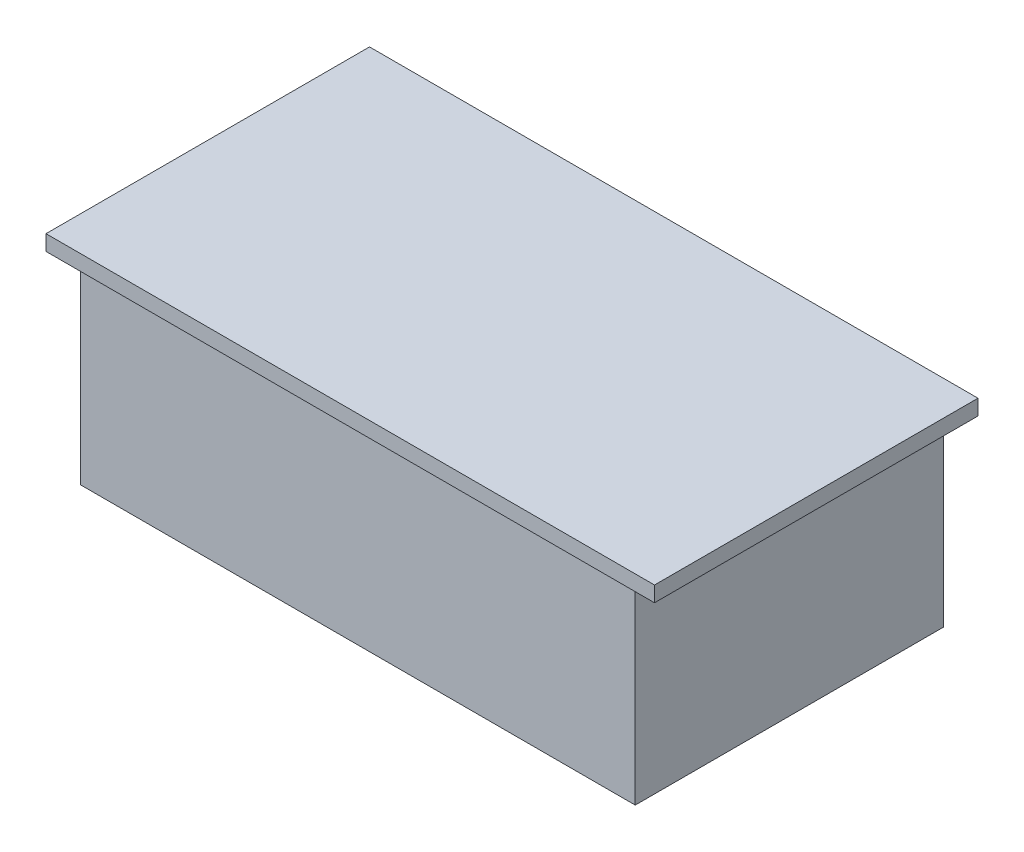
ISO-10303-21;
HEADER;
FILE_DESCRIPTION(('STEP AP214'),'2;1');
FILE_NAME('part.step','',(''),(''),'','','');
FILE_SCHEMA(('AUTOMOTIVE_DESIGN { 1 0 10303 214 1 1 1 1 }'));
ENDSEC;
DATA;
#1=APPLICATION_CONTEXT('core data for automotive mechanical design processes');
#2=APPLICATION_PROTOCOL_DEFINITION('international standard','automotive_design',2000,#1);
#3=PRODUCT_CONTEXT('',#1,'mechanical');
#4=PRODUCT('Part','Part','',(#3));
#5=PRODUCT_RELATED_PRODUCT_CATEGORY('part','',(#4));
#6=PRODUCT_DEFINITION_FORMATION('','',#4);
#7=PRODUCT_DEFINITION_CONTEXT('part definition',#1,'design');
#8=PRODUCT_DEFINITION('design','',#6,#7);
#9=PRODUCT_DEFINITION_SHAPE('','',#8);
#10=(LENGTH_UNIT() NAMED_UNIT(*) SI_UNIT(.MILLI.,.METRE.));
#11=(NAMED_UNIT(*) PLANE_ANGLE_UNIT() SI_UNIT($,.RADIAN.));
#12=(NAMED_UNIT(*) SI_UNIT($,.STERADIAN.) SOLID_ANGLE_UNIT());
#13=UNCERTAINTY_MEASURE_WITH_UNIT(LENGTH_MEASURE(1.E-05),#10,'distance_accuracy_value','');
#14=(GEOMETRIC_REPRESENTATION_CONTEXT(3) GLOBAL_UNCERTAINTY_ASSIGNED_CONTEXT((#13)) GLOBAL_UNIT_ASSIGNED_CONTEXT((#10,
#11,#12)) REPRESENTATION_CONTEXT('',''));
#15=CARTESIAN_POINT('',(0.,0.,0.));
#16=DIRECTION('',(0.,0.,1.));
#17=DIRECTION('',(1.,0.,0.));
#18=AXIS2_PLACEMENT_3D('',#15,#16,#17);
#19=CARTESIAN_POINT('',(-39.5,27.,0.));
#20=DIRECTION('',(1.,0.,0.));
#21=DIRECTION('',(0.,0.,-1.));
#22=AXIS2_PLACEMENT_3D('',#19,#20,#21);
#23=PLANE('',#22);
#24=DIRECTION('',(0.,0.,1.));
#25=VECTOR('',#24,1.);
#26=CARTESIAN_POINT('',(-39.5,25.,0.));
#27=LINE('',#26,#25);
#28=CARTESIAN_POINT('',(-39.5,25.,-21.));
#29=VERTEX_POINT('',#28);
#30=CARTESIAN_POINT('',(-39.5,25.,21.));
#31=VERTEX_POINT('',#30);
#32=EDGE_CURVE('E111',#29,#31,#27,.T.);
#33=ORIENTED_EDGE('',*,*,#32,.T.);
#34=DIRECTION('',(0.,-1.,0.));
#35=VECTOR('',#34,1.);
#36=CARTESIAN_POINT('',(-39.5,27.,21.));
#37=LINE('',#36,#35);
#38=CARTESIAN_POINT('',(-39.5,27.,21.));
#39=VERTEX_POINT('',#38);
#40=EDGE_CURVE('E12',#39,#31,#37,.T.);
#41=ORIENTED_EDGE('',*,*,#40,.F.);
#42=DIRECTION('',(0.,0.,1.));
#43=VECTOR('',#42,1.);
#44=CARTESIAN_POINT('',(-39.5,27.,0.));
#45=LINE('',#44,#43);
#46=CARTESIAN_POINT('',(-39.5,27.,-21.));
#47=VERTEX_POINT('',#46);
#48=EDGE_CURVE('E88',#47,#39,#45,.T.);
#49=ORIENTED_EDGE('',*,*,#48,.F.);
#50=DIRECTION('',(0.,-1.,0.));
#51=VECTOR('',#50,1.);
#52=CARTESIAN_POINT('',(-39.5,27.,-21.));
#53=LINE('',#52,#51);
#54=EDGE_CURVE('E107',#47,#29,#53,.T.);
#55=ORIENTED_EDGE('',*,*,#54,.T.);
#56=EDGE_LOOP('',(#33,#41,#49,#55));
#57=FACE_BOUND('',#56,.T.);
#58=ADVANCED_FACE('F49',(#57),#23,.F.);
#59=CARTESIAN_POINT('',(0.,27.,21.));
#60=DIRECTION('',(0.,0.,1.));
#61=DIRECTION('',(1.,0.,0.));
#62=AXIS2_PLACEMENT_3D('',#59,#60,#61);
#63=PLANE('',#62);
#64=DIRECTION('',(-1.,0.,0.));
#65=VECTOR('',#64,1.);
#66=CARTESIAN_POINT('',(0.,25.,21.));
#67=LINE('',#66,#65);
#68=CARTESIAN_POINT('',(39.5,25.,21.));
#69=VERTEX_POINT('',#68);
#70=EDGE_CURVE('E97',#69,#31,#67,.T.);
#71=ORIENTED_EDGE('',*,*,#70,.F.);
#72=DIRECTION('',(0.,-1.,0.));
#73=VECTOR('',#72,1.);
#74=CARTESIAN_POINT('',(39.5,27.,21.));
#75=LINE('',#74,#73);
#76=CARTESIAN_POINT('',(39.5,27.,21.));
#77=VERTEX_POINT('',#76);
#78=EDGE_CURVE('E57',#77,#69,#75,.T.);
#79=ORIENTED_EDGE('',*,*,#78,.F.);
#80=DIRECTION('',(-1.,0.,0.));
#81=VECTOR('',#80,1.);
#82=CARTESIAN_POINT('',(0.,27.,21.));
#83=LINE('',#82,#81);
#84=EDGE_CURVE('E95',#77,#39,#83,.T.);
#85=ORIENTED_EDGE('',*,*,#84,.T.);
#86=ORIENTED_EDGE('',*,*,#40,.T.);
#87=EDGE_LOOP('',(#71,#79,#85,#86));
#88=FACE_BOUND('',#87,.T.);
#89=ADVANCED_FACE('F94',(#88),#63,.T.);
#90=CARTESIAN_POINT('',(39.5,27.,0.));
#91=DIRECTION('',(1.,0.,0.));
#92=DIRECTION('',(0.,0.,-1.));
#93=AXIS2_PLACEMENT_3D('',#90,#91,#92);
#94=PLANE('',#93);
#95=DIRECTION('',(0.,0.,1.));
#96=VECTOR('',#95,1.);
#97=CARTESIAN_POINT('',(39.5,25.,0.));
#98=LINE('',#97,#96);
#99=CARTESIAN_POINT('',(39.5,25.,-21.));
#100=VERTEX_POINT('',#99);
#101=EDGE_CURVE('E115',#100,#69,#98,.T.);
#102=ORIENTED_EDGE('',*,*,#101,.F.);
#103=DIRECTION('',(0.,-1.,0.));
#104=VECTOR('',#103,1.);
#105=CARTESIAN_POINT('',(39.5,27.,-21.));
#106=LINE('',#105,#104);
#107=CARTESIAN_POINT('',(39.5,27.,-21.));
#108=VERTEX_POINT('',#107);
#109=EDGE_CURVE('E80',#108,#100,#106,.T.);
#110=ORIENTED_EDGE('',*,*,#109,.F.);
#111=DIRECTION('',(0.,0.,1.));
#112=VECTOR('',#111,1.);
#113=CARTESIAN_POINT('',(39.5,27.,0.));
#114=LINE('',#113,#112);
#115=EDGE_CURVE('E103',#108,#77,#114,.T.);
#116=ORIENTED_EDGE('',*,*,#115,.T.);
#117=ORIENTED_EDGE('',*,*,#78,.T.);
#118=EDGE_LOOP('',(#102,#110,#116,#117));
#119=FACE_BOUND('',#118,.T.);
#120=ADVANCED_FACE('F105',(#119),#94,.T.);
#121=CARTESIAN_POINT('',(0.,27.,-21.));
#122=DIRECTION('',(0.,0.,1.));
#123=DIRECTION('',(1.,0.,0.));
#124=AXIS2_PLACEMENT_3D('',#121,#122,#123);
#125=PLANE('',#124);
#126=DIRECTION('',(-1.,0.,0.));
#127=VECTOR('',#126,1.);
#128=CARTESIAN_POINT('',(0.,25.,-21.));
#129=LINE('',#128,#127);
#130=EDGE_CURVE('E83',#100,#29,#129,.T.);
#131=ORIENTED_EDGE('',*,*,#130,.T.);
#132=ORIENTED_EDGE('',*,*,#54,.F.);
#133=DIRECTION('',(-1.,0.,0.));
#134=VECTOR('',#133,1.);
#135=CARTESIAN_POINT('',(0.,27.,-21.));
#136=LINE('',#135,#134);
#137=EDGE_CURVE('E65',#108,#47,#136,.T.);
#138=ORIENTED_EDGE('',*,*,#137,.F.);
#139=ORIENTED_EDGE('',*,*,#109,.T.);
#140=EDGE_LOOP('',(#131,#132,#138,#139));
#141=FACE_BOUND('',#140,.T.);
#142=ADVANCED_FACE('F128',(#141),#125,.F.);
#143=CARTESIAN_POINT('',(0.,27.,0.));
#144=DIRECTION('',(0.,-1.,0.));
#145=DIRECTION('',(0.,0.,-1.));
#146=AXIS2_PLACEMENT_3D('',#143,#144,#145);
#147=PLANE('',#146);
#148=ORIENTED_EDGE('',*,*,#48,.T.);
#149=ORIENTED_EDGE('',*,*,#84,.F.);
#150=ORIENTED_EDGE('',*,*,#115,.F.);
#151=ORIENTED_EDGE('',*,*,#137,.T.);
#152=EDGE_LOOP('',(#148,#149,#150,#151));
#153=FACE_BOUND('',#152,.T.);
#154=ADVANCED_FACE('F102',(#153),#147,.F.);
#155=CARTESIAN_POINT('',(0.,25.,0.));
#156=DIRECTION('',(0.,-1.,0.));
#157=DIRECTION('',(0.,0.,-1.));
#158=AXIS2_PLACEMENT_3D('',#155,#156,#157);
#159=PLANE('',#158);
#160=ORIENTED_EDGE('',*,*,#32,.F.);
#161=ORIENTED_EDGE('',*,*,#130,.F.);
#162=ORIENTED_EDGE('',*,*,#101,.T.);
#163=ORIENTED_EDGE('',*,*,#70,.T.);
#164=EDGE_LOOP('',(#160,#161,#162,#163));
#165=FACE_BOUND('',#164,.T.);
#166=ADVANCED_FACE('F122',(#165),#159,.T.);
#167=CLOSED_SHELL('',(#58,#89,#120,#142,#154,#166));
#168=MANIFOLD_SOLID_BREP('B2',#167);
#169=CARTESIAN_POINT('',(-36.,25.,20.));
#170=DIRECTION('',(0.,0.,-1.));
#171=DIRECTION('',(-1.,0.,0.));
#172=AXIS2_PLACEMENT_3D('',#169,#170,#171);
#173=PLANE('',#172);
#174=DIRECTION('',(1.,0.,0.));
#175=VECTOR('',#174,1.);
#176=CARTESIAN_POINT('',(-36.,0.,20.));
#177=LINE('',#176,#175);
#178=CARTESIAN_POINT('',(-36.,0.,20.));
#179=VERTEX_POINT('',#178);
#180=CARTESIAN_POINT('',(36.,0.,20.));
#181=VERTEX_POINT('',#180);
#182=EDGE_CURVE('E241',#179,#181,#177,.T.);
#183=ORIENTED_EDGE('',*,*,#182,.T.);
#184=DIRECTION('',(0.,-1.,0.));
#185=VECTOR('',#184,1.);
#186=CARTESIAN_POINT('',(36.,25.,20.));
#187=LINE('',#186,#185);
#188=CARTESIAN_POINT('',(36.,25.,20.));
#189=VERTEX_POINT('',#188);
#190=EDGE_CURVE('E47',#189,#181,#187,.T.);
#191=ORIENTED_EDGE('',*,*,#190,.F.);
#192=DIRECTION('',(1.,0.,0.));
#193=VECTOR('',#192,1.);
#194=CARTESIAN_POINT('',(-36.,25.,20.));
#195=LINE('',#194,#193);
#196=CARTESIAN_POINT('',(-36.,25.,20.));
#197=VERTEX_POINT('',#196);
#198=EDGE_CURVE('E223',#197,#189,#195,.T.);
#199=ORIENTED_EDGE('',*,*,#198,.F.);
#200=DIRECTION('',(0.,-1.,0.));
#201=VECTOR('',#200,1.);
#202=CARTESIAN_POINT('',(-36.,25.,20.));
#203=LINE('',#202,#201);
#204=EDGE_CURVE('E190',#197,#179,#203,.T.);
#205=ORIENTED_EDGE('',*,*,#204,.T.);
#206=EDGE_LOOP('',(#183,#191,#199,#205));
#207=FACE_BOUND('',#206,.T.);
#208=ADVANCED_FACE('F173',(#207),#173,.F.);
#209=CARTESIAN_POINT('',(36.,25.,20.));
#210=DIRECTION('',(-1.,0.,0.));
#211=DIRECTION('',(0.,0.,1.));
#212=AXIS2_PLACEMENT_3D('',#209,#210,#211);
#213=PLANE('',#212);
#214=DIRECTION('',(0.,0.,-1.));
#215=VECTOR('',#214,1.);
#216=CARTESIAN_POINT('',(36.,0.,20.));
#217=LINE('',#216,#215);
#218=CARTESIAN_POINT('',(36.,0.,-20.));
#219=VERTEX_POINT('',#218);
#220=EDGE_CURVE('E229',#181,#219,#217,.T.);
#221=ORIENTED_EDGE('',*,*,#220,.T.);
#222=DIRECTION('',(0.,-1.,0.));
#223=VECTOR('',#222,1.);
#224=CARTESIAN_POINT('',(36.,25.,-20.));
#225=LINE('',#224,#223);
#226=CARTESIAN_POINT('',(36.,25.,-20.));
#227=VERTEX_POINT('',#226);
#228=EDGE_CURVE('E182',#227,#219,#225,.T.);
#229=ORIENTED_EDGE('',*,*,#228,.F.);
#230=DIRECTION('',(0.,0.,-1.));
#231=VECTOR('',#230,1.);
#232=CARTESIAN_POINT('',(36.,25.,20.));
#233=LINE('',#232,#231);
#234=EDGE_CURVE('E215',#189,#227,#233,.T.);
#235=ORIENTED_EDGE('',*,*,#234,.F.);
#236=ORIENTED_EDGE('',*,*,#190,.T.);
#237=EDGE_LOOP('',(#221,#229,#235,#236));
#238=FACE_BOUND('',#237,.T.);
#239=ADVANCED_FACE('F228',(#238),#213,.F.);
#240=CARTESIAN_POINT('',(-36.,25.,-20.));
#241=DIRECTION('',(0.,0.,-1.));
#242=DIRECTION('',(-1.,0.,0.));
#243=AXIS2_PLACEMENT_3D('',#240,#241,#242);
#244=PLANE('',#243);
#245=DIRECTION('',(1.,0.,0.));
#246=VECTOR('',#245,1.);
#247=CARTESIAN_POINT('',(-36.,0.,-20.));
#248=LINE('',#247,#246);
#249=CARTESIAN_POINT('',(-36.,0.,-20.));
#250=VERTEX_POINT('',#249);
#251=EDGE_CURVE('E246',#250,#219,#248,.T.);
#252=ORIENTED_EDGE('',*,*,#251,.F.);
#253=DIRECTION('',(0.,-1.,0.));
#254=VECTOR('',#253,1.);
#255=CARTESIAN_POINT('',(-36.,25.,-20.));
#256=LINE('',#255,#254);
#257=CARTESIAN_POINT('',(-36.,25.,-20.));
#258=VERTEX_POINT('',#257);
#259=EDGE_CURVE('E204',#258,#250,#256,.T.);
#260=ORIENTED_EDGE('',*,*,#259,.F.);
#261=DIRECTION('',(1.,0.,0.));
#262=VECTOR('',#261,1.);
#263=CARTESIAN_POINT('',(-36.,25.,-20.));
#264=LINE('',#263,#262);
#265=EDGE_CURVE('E222',#258,#227,#264,.T.);
#266=ORIENTED_EDGE('',*,*,#265,.T.);
#267=ORIENTED_EDGE('',*,*,#228,.T.);
#268=EDGE_LOOP('',(#252,#260,#266,#267));
#269=FACE_BOUND('',#268,.T.);
#270=ADVANCED_FACE('F233',(#269),#244,.T.);
#271=CARTESIAN_POINT('',(-36.,25.,20.));
#272=DIRECTION('',(-1.,0.,0.));
#273=DIRECTION('',(0.,0.,1.));
#274=AXIS2_PLACEMENT_3D('',#271,#272,#273);
#275=PLANE('',#274);
#276=DIRECTION('',(0.,0.,-1.));
#277=VECTOR('',#276,1.);
#278=CARTESIAN_POINT('',(-36.,0.,20.));
#279=LINE('',#278,#277);
#280=EDGE_CURVE('E249',#179,#250,#279,.T.);
#281=ORIENTED_EDGE('',*,*,#280,.F.);
#282=ORIENTED_EDGE('',*,*,#204,.F.);
#283=DIRECTION('',(0.,0.,-1.));
#284=VECTOR('',#283,1.);
#285=CARTESIAN_POINT('',(-36.,25.,20.));
#286=LINE('',#285,#284);
#287=EDGE_CURVE('E235',#197,#258,#286,.T.);
#288=ORIENTED_EDGE('',*,*,#287,.T.);
#289=ORIENTED_EDGE('',*,*,#259,.T.);
#290=EDGE_LOOP('',(#281,#282,#288,#289));
#291=FACE_BOUND('',#290,.T.);
#292=ADVANCED_FACE('F259',(#291),#275,.T.);
#293=CARTESIAN_POINT('',(0.,25.,0.));
#294=DIRECTION('',(0.,1.,0.));
#295=DIRECTION('',(0.,0.,1.));
#296=AXIS2_PLACEMENT_3D('',#293,#294,#295);
#297=PLANE('',#296);
#298=ORIENTED_EDGE('',*,*,#198,.T.);
#299=ORIENTED_EDGE('',*,*,#234,.T.);
#300=ORIENTED_EDGE('',*,*,#265,.F.);
#301=ORIENTED_EDGE('',*,*,#287,.F.);
#302=EDGE_LOOP('',(#298,#299,#300,#301));
#303=FACE_BOUND('',#302,.T.);
#304=ADVANCED_FACE('F219',(#303),#297,.T.);
#305=CARTESIAN_POINT('',(0.,0.,0.));
#306=DIRECTION('',(0.,1.,0.));
#307=DIRECTION('',(0.,0.,1.));
#308=AXIS2_PLACEMENT_3D('',#305,#306,#307);
#309=PLANE('',#308);
#310=ORIENTED_EDGE('',*,*,#182,.F.);
#311=ORIENTED_EDGE('',*,*,#280,.T.);
#312=ORIENTED_EDGE('',*,*,#251,.T.);
#313=ORIENTED_EDGE('',*,*,#220,.F.);
#314=EDGE_LOOP('',(#310,#311,#312,#313));
#315=FACE_BOUND('',#314,.T.);
#316=ADVANCED_FACE('F258',(#315),#309,.F.);
#317=CLOSED_SHELL('',(#208,#239,#270,#292,#304,#316));
#318=MANIFOLD_SOLID_BREP('B6',#317);
#319=ADVANCED_BREP_SHAPE_REPRESENTATION('',(#18,#168,#318),#14);
#320=SHAPE_DEFINITION_REPRESENTATION(#9,#319);
ENDSEC;
END-ISO-10303-21;
